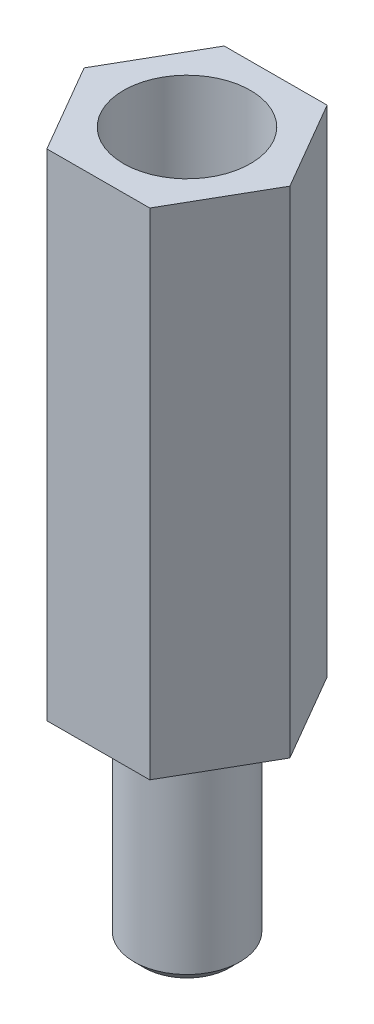
ISO-10303-21;
HEADER;
FILE_DESCRIPTION(('STEP AP214'),'2;1');
FILE_NAME('part.step','',(''),(''),'','','');
FILE_SCHEMA(('AUTOMOTIVE_DESIGN { 1 0 10303 214 1 1 1 1 }'));
ENDSEC;
DATA;
#1=APPLICATION_CONTEXT('core data for automotive mechanical design processes');
#2=APPLICATION_PROTOCOL_DEFINITION('international standard','automotive_design',2000,#1);
#3=PRODUCT_CONTEXT('',#1,'mechanical');
#4=PRODUCT('Part','Part','',(#3));
#5=PRODUCT_RELATED_PRODUCT_CATEGORY('part','',(#4));
#6=PRODUCT_DEFINITION_FORMATION('','',#4);
#7=PRODUCT_DEFINITION_CONTEXT('part definition',#1,'design');
#8=PRODUCT_DEFINITION('design','',#6,#7);
#9=PRODUCT_DEFINITION_SHAPE('','',#8);
#10=(LENGTH_UNIT() NAMED_UNIT(*) SI_UNIT(.MILLI.,.METRE.));
#11=(NAMED_UNIT(*) PLANE_ANGLE_UNIT() SI_UNIT($,.RADIAN.));
#12=(NAMED_UNIT(*) SI_UNIT($,.STERADIAN.) SOLID_ANGLE_UNIT());
#13=UNCERTAINTY_MEASURE_WITH_UNIT(LENGTH_MEASURE(1.E-05),#10,'distance_accuracy_value','');
#14=(GEOMETRIC_REPRESENTATION_CONTEXT(3) GLOBAL_UNCERTAINTY_ASSIGNED_CONTEXT((#13)) GLOBAL_UNIT_ASSIGNED_CONTEXT((#10,
#11,#12)) REPRESENTATION_CONTEXT('',''));
#15=CARTESIAN_POINT('',(0.,0.,0.));
#16=DIRECTION('',(0.,0.,1.));
#17=DIRECTION('',(1.,0.,0.));
#18=AXIS2_PLACEMENT_3D('',#15,#16,#17);
#19=CARTESIAN_POINT('',(1.20724982800236,11.7,-2.10298546185852));
#20=DIRECTION('',(0.00246764089411733,0.,0.999996955369574));
#21=DIRECTION('',(0.999996955369574,0.,-0.00246764089411733));
#22=AXIS2_PLACEMENT_3D('',#19,#20,#21);
#23=PLANE('',#22);
#24=DIRECTION('',(-0.999996955369574,0.,0.00246764089411733));
#25=VECTOR('',#24,1.);
#26=CARTESIAN_POINT('',(1.20724982800236,0.,-2.10298546185852));
#27=LINE('',#26,#25);
#28=CARTESIAN_POINT('',(1.20724982800236,0.,-2.10298546185852));
#29=VERTEX_POINT('',#28);
#30=CARTESIAN_POINT('',(-1.21761391975765,0.,-2.09700175069369));
#31=VERTEX_POINT('',#30);
#32=EDGE_CURVE('E124',#29,#31,#27,.T.);
#33=ORIENTED_EDGE('',*,*,#32,.T.);
#34=DIRECTION('',(0.,-1.,0.));
#35=VECTOR('',#34,1.);
#36=CARTESIAN_POINT('',(-1.21761391975765,11.7,-2.09700175069369));
#37=LINE('',#36,#35);
#38=CARTESIAN_POINT('',(-1.21761391975765,11.7,-2.09700175069369));
#39=VERTEX_POINT('',#38);
#40=EDGE_CURVE('E11',#39,#31,#37,.T.);
#41=ORIENTED_EDGE('',*,*,#40,.F.);
#42=DIRECTION('',(-0.999996955369574,0.,0.00246764089411733));
#43=VECTOR('',#42,1.);
#44=CARTESIAN_POINT('',(1.20724982800236,11.7,-2.10298546185852));
#45=LINE('',#44,#43);
#46=CARTESIAN_POINT('',(1.20724982800236,11.7,-2.10298546185852));
#47=VERTEX_POINT('',#46);
#48=EDGE_CURVE('E135',#47,#39,#45,.T.);
#49=ORIENTED_EDGE('',*,*,#48,.F.);
#50=DIRECTION('',(0.,-1.,0.));
#51=VECTOR('',#50,1.);
#52=CARTESIAN_POINT('',(1.20724982800236,11.7,-2.10298546185852));
#53=LINE('',#52,#51);
#54=EDGE_CURVE('E120',#47,#29,#53,.T.);
#55=ORIENTED_EDGE('',*,*,#54,.T.);
#56=EDGE_LOOP('',(#33,#41,#49,#55));
#57=FACE_BOUND('',#56,.T.);
#58=ADVANCED_FACE('F40',(#57),#23,.F.);
#59=CARTESIAN_POINT('',(-1.21761391975765,11.7,-2.09700175069369));
#60=DIRECTION('',(0.867256587504203,0.,0.497861437983064));
#61=DIRECTION('',(0.497861437983064,0.,-0.867256587504203));
#62=AXIS2_PLACEMENT_3D('',#59,#60,#61);
#63=PLANE('',#62);
#64=DIRECTION('',(-0.497861437983064,0.,0.867256587504203));
#65=VECTOR('',#64,1.);
#66=CARTESIAN_POINT('',(-1.21761391975765,0.,-2.09700175069369));
#67=LINE('',#66,#65);
#68=CARTESIAN_POINT('',(-2.42486374776001,0.,0.00598371116482524));
#69=VERTEX_POINT('',#68);
#70=EDGE_CURVE('E127',#31,#69,#67,.T.);
#71=ORIENTED_EDGE('',*,*,#70,.T.);
#72=DIRECTION('',(0.,-1.,0.));
#73=VECTOR('',#72,1.);
#74=CARTESIAN_POINT('',(-2.42486374776001,11.7,0.00598371116482524));
#75=LINE('',#74,#73);
#76=CARTESIAN_POINT('',(-2.42486374776001,11.7,0.00598371116482524));
#77=VERTEX_POINT('',#76);
#78=EDGE_CURVE('E48',#77,#69,#75,.T.);
#79=ORIENTED_EDGE('',*,*,#78,.F.);
#80=DIRECTION('',(-0.497861437983064,0.,0.867256587504203));
#81=VECTOR('',#80,1.);
#82=CARTESIAN_POINT('',(-1.21761391975765,11.7,-2.09700175069369));
#83=LINE('',#82,#81);
#84=EDGE_CURVE('E93',#39,#77,#83,.T.);
#85=ORIENTED_EDGE('',*,*,#84,.F.);
#86=ORIENTED_EDGE('',*,*,#40,.T.);
#87=EDGE_LOOP('',(#71,#79,#85,#86));
#88=FACE_BOUND('',#87,.T.);
#89=ADVANCED_FACE('F161',(#88),#63,.F.);
#90=CARTESIAN_POINT('',(-2.42486374776001,11.7,0.00598371116482524));
#91=DIRECTION('',(0.864788946610086,0.,-0.50213551738651));
#92=DIRECTION('',(-0.50213551738651,0.,-0.864788946610086));
#93=AXIS2_PLACEMENT_3D('',#90,#91,#92);
#94=PLANE('',#93);
#95=DIRECTION('',(0.50213551738651,0.,0.864788946610086));
#96=VECTOR('',#95,1.);
#97=CARTESIAN_POINT('',(-2.42486374776001,0.,0.00598371116482524));
#98=LINE('',#97,#96);
#99=CARTESIAN_POINT('',(-1.20724982800236,0.,2.10298546185852));
#100=VERTEX_POINT('',#99);
#101=EDGE_CURVE('E130',#69,#100,#98,.T.);
#102=ORIENTED_EDGE('',*,*,#101,.T.);
#103=DIRECTION('',(0.,-1.,0.));
#104=VECTOR('',#103,1.);
#105=CARTESIAN_POINT('',(-1.20724982800236,11.7,2.10298546185852));
#106=LINE('',#105,#104);
#107=CARTESIAN_POINT('',(-1.20724982800236,11.7,2.10298546185852));
#108=VERTEX_POINT('',#107);
#109=EDGE_CURVE('E115',#108,#100,#106,.T.);
#110=ORIENTED_EDGE('',*,*,#109,.F.);
#111=DIRECTION('',(0.50213551738651,0.,0.864788946610086));
#112=VECTOR('',#111,1.);
#113=CARTESIAN_POINT('',(-2.42486374776001,11.7,0.00598371116482524));
#114=LINE('',#113,#112);
#115=EDGE_CURVE('E106',#77,#108,#114,.T.);
#116=ORIENTED_EDGE('',*,*,#115,.F.);
#117=ORIENTED_EDGE('',*,*,#78,.T.);
#118=EDGE_LOOP('',(#102,#110,#116,#117));
#119=FACE_BOUND('',#118,.T.);
#120=ADVANCED_FACE('F141',(#119),#94,.F.);
#121=CARTESIAN_POINT('',(-1.20724982800236,11.7,2.10298546185852));
#122=DIRECTION('',(-0.00246764089411769,0.,-0.999996955369574));
#123=DIRECTION('',(-0.999996955369574,0.,0.00246764089411769));
#124=AXIS2_PLACEMENT_3D('',#121,#122,#123);
#125=PLANE('',#124);
#126=DIRECTION('',(0.999996955369574,0.,-0.00246764089411769));
#127=VECTOR('',#126,1.);
#128=CARTESIAN_POINT('',(-1.20724982800236,0.,2.10298546185852));
#129=LINE('',#128,#127);
#130=CARTESIAN_POINT('',(1.21761391975765,0.,2.09700175069369));
#131=VERTEX_POINT('',#130);
#132=EDGE_CURVE('E114',#100,#131,#129,.T.);
#133=ORIENTED_EDGE('',*,*,#132,.T.);
#134=DIRECTION('',(0.,-1.,0.));
#135=VECTOR('',#134,1.);
#136=CARTESIAN_POINT('',(1.21761391975765,11.7,2.09700175069369));
#137=LINE('',#136,#135);
#138=CARTESIAN_POINT('',(1.21761391975765,11.7,2.09700175069369));
#139=VERTEX_POINT('',#138);
#140=EDGE_CURVE('E111',#139,#131,#137,.T.);
#141=ORIENTED_EDGE('',*,*,#140,.F.);
#142=DIRECTION('',(0.999996955369574,0.,-0.00246764089411769));
#143=VECTOR('',#142,1.);
#144=CARTESIAN_POINT('',(-1.20724982800236,11.7,2.10298546185852));
#145=LINE('',#144,#143);
#146=EDGE_CURVE('E100',#108,#139,#145,.T.);
#147=ORIENTED_EDGE('',*,*,#146,.F.);
#148=ORIENTED_EDGE('',*,*,#109,.T.);
#149=EDGE_LOOP('',(#133,#141,#147,#148));
#150=FACE_BOUND('',#149,.T.);
#151=ADVANCED_FACE('F112',(#150),#125,.F.);
#152=CARTESIAN_POINT('',(1.21761391975765,11.7,2.09700175069369));
#153=DIRECTION('',(-0.867256587504203,0.,-0.497861437983064));
#154=DIRECTION('',(-0.497861437983064,0.,0.867256587504203));
#155=AXIS2_PLACEMENT_3D('',#152,#153,#154);
#156=PLANE('',#155);
#157=DIRECTION('',(0.497861437983064,0.,-0.867256587504203));
#158=VECTOR('',#157,1.);
#159=CARTESIAN_POINT('',(1.21761391975765,0.,2.09700175069369));
#160=LINE('',#159,#158);
#161=CARTESIAN_POINT('',(2.42486374776001,0.,-0.00598371116482452));
#162=VERTEX_POINT('',#161);
#163=EDGE_CURVE('E79',#131,#162,#160,.T.);
#164=ORIENTED_EDGE('',*,*,#163,.T.);
#165=DIRECTION('',(0.,-1.,0.));
#166=VECTOR('',#165,1.);
#167=CARTESIAN_POINT('',(2.42486374776001,11.7,-0.00598371116482452));
#168=LINE('',#167,#166);
#169=CARTESIAN_POINT('',(2.42486374776001,11.7,-0.00598371116482452));
#170=VERTEX_POINT('',#169);
#171=EDGE_CURVE('E116',#170,#162,#168,.T.);
#172=ORIENTED_EDGE('',*,*,#171,.F.);
#173=DIRECTION('',(0.497861437983064,0.,-0.867256587504203));
#174=VECTOR('',#173,1.);
#175=CARTESIAN_POINT('',(1.21761391975765,11.7,2.09700175069369));
#176=LINE('',#175,#174);
#177=EDGE_CURVE('E104',#139,#170,#176,.T.);
#178=ORIENTED_EDGE('',*,*,#177,.F.);
#179=ORIENTED_EDGE('',*,*,#140,.T.);
#180=EDGE_LOOP('',(#164,#172,#178,#179));
#181=FACE_BOUND('',#180,.T.);
#182=ADVANCED_FACE('F118',(#181),#156,.F.);
#183=CARTESIAN_POINT('',(2.42486374776001,11.7,-0.00598371116482452));
#184=DIRECTION('',(-0.864788946610086,0.,0.50213551738651));
#185=DIRECTION('',(0.50213551738651,0.,0.864788946610086));
#186=AXIS2_PLACEMENT_3D('',#183,#184,#185);
#187=PLANE('',#186);
#188=DIRECTION('',(-0.50213551738651,0.,-0.864788946610086));
#189=VECTOR('',#188,1.);
#190=CARTESIAN_POINT('',(2.42486374776001,0.,-0.00598371116482452));
#191=LINE('',#190,#189);
#192=EDGE_CURVE('E85',#162,#29,#191,.T.);
#193=ORIENTED_EDGE('',*,*,#192,.T.);
#194=ORIENTED_EDGE('',*,*,#54,.F.);
#195=DIRECTION('',(-0.50213551738651,0.,-0.864788946610086));
#196=VECTOR('',#195,1.);
#197=CARTESIAN_POINT('',(2.42486374776001,11.7,-0.00598371116482452));
#198=LINE('',#197,#196);
#199=EDGE_CURVE('E56',#170,#47,#198,.T.);
#200=ORIENTED_EDGE('',*,*,#199,.F.);
#201=ORIENTED_EDGE('',*,*,#171,.T.);
#202=EDGE_LOOP('',(#193,#194,#200,#201));
#203=FACE_BOUND('',#202,.T.);
#204=ADVANCED_FACE('F149',(#203),#187,.F.);
#205=CARTESIAN_POINT('',(0.,11.7,0.));
#206=DIRECTION('',(0.,1.,0.));
#207=DIRECTION('',(0.,0.,1.));
#208=AXIS2_PLACEMENT_3D('',#205,#206,#207);
#209=PLANE('',#208);
#210=CARTESIAN_POINT('',(0.,11.7,0.));
#211=DIRECTION('',(0.,1.,0.));
#212=DIRECTION('',(0.,0.,1.));
#213=AXIS2_PLACEMENT_3D('',#210,#211,#212);
#214=CIRCLE('',#213,1.5);
#215=CARTESIAN_POINT('',(0.,11.7,1.5));
#216=VERTEX_POINT('',#215);
#217=EDGE_CURVE('E269',#216,#216,#214,.T.);
#218=ORIENTED_EDGE('',*,*,#217,.F.);
#219=EDGE_LOOP('',(#218));
#220=FACE_BOUND('',#219,.T.);
#221=ORIENTED_EDGE('',*,*,#48,.T.);
#222=ORIENTED_EDGE('',*,*,#84,.T.);
#223=ORIENTED_EDGE('',*,*,#115,.T.);
#224=ORIENTED_EDGE('',*,*,#146,.T.);
#225=ORIENTED_EDGE('',*,*,#177,.T.);
#226=ORIENTED_EDGE('',*,*,#199,.T.);
#227=EDGE_LOOP('',(#221,#222,#223,#224,#225,#226));
#228=FACE_BOUND('',#227,.T.);
#229=ADVANCED_FACE('F102',(#220,#228),#209,.T.);
#230=CARTESIAN_POINT('',(0.,0.,0.));
#231=DIRECTION('',(0.,1.,0.));
#232=DIRECTION('',(0.,0.,1.));
#233=AXIS2_PLACEMENT_3D('',#230,#231,#232);
#234=PLANE('',#233);
#235=ORIENTED_EDGE('',*,*,#32,.F.);
#236=ORIENTED_EDGE('',*,*,#192,.F.);
#237=ORIENTED_EDGE('',*,*,#163,.F.);
#238=ORIENTED_EDGE('',*,*,#132,.F.);
#239=ORIENTED_EDGE('',*,*,#101,.F.);
#240=ORIENTED_EDGE('',*,*,#70,.F.);
#241=EDGE_LOOP('',(#235,#236,#237,#238,#239,#240));
#242=FACE_BOUND('',#241,.T.);
#243=CARTESIAN_POINT('',(0.,0.,0.));
#244=DIRECTION('',(0.,1.,0.));
#245=DIRECTION('',(0.,0.,1.));
#246=AXIS2_PLACEMENT_3D('',#243,#244,#245);
#247=CIRCLE('',#246,1.25);
#248=CARTESIAN_POINT('',(0.,0.,1.25));
#249=VERTEX_POINT('',#248);
#250=EDGE_CURVE('E270',#249,#249,#247,.T.);
#251=ORIENTED_EDGE('',*,*,#250,.T.);
#252=EDGE_LOOP('',(#251));
#253=FACE_BOUND('',#252,.T.);
#254=ADVANCED_FACE('F144',(#242,#253),#234,.F.);
#255=CARTESIAN_POINT('',(0.,1.7,0.));
#256=DIRECTION('',(0.,1.,0.));
#257=DIRECTION('',(0.,0.,1.));
#258=AXIS2_PLACEMENT_3D('',#255,#256,#257);
#259=CYLINDRICAL_SURFACE('',#258,1.5);
#260=CARTESIAN_POINT('',(0.,1.7,0.));
#261=DIRECTION('',(0.,1.,0.));
#262=DIRECTION('',(0.,0.,1.));
#263=AXIS2_PLACEMENT_3D('',#260,#261,#262);
#264=CIRCLE('',#263,1.5);
#265=CARTESIAN_POINT('',(0.,1.7,1.5));
#266=VERTEX_POINT('',#265);
#267=EDGE_CURVE('E128',#266,#266,#264,.T.);
#268=ORIENTED_EDGE('',*,*,#267,.F.);
#269=EDGE_LOOP('',(#268));
#270=FACE_BOUND('',#269,.T.);
#271=ORIENTED_EDGE('',*,*,#217,.T.);
#272=EDGE_LOOP('',(#271));
#273=FACE_BOUND('',#272,.T.);
#274=ADVANCED_FACE('F219',(#270,#273),#259,.F.);
#275=CARTESIAN_POINT('',(0.,1.7,0.));
#276=DIRECTION('',(0.,1.,0.));
#277=DIRECTION('',(0.,0.,1.));
#278=AXIS2_PLACEMENT_3D('',#275,#276,#277);
#279=PLANE('',#278);
#280=ORIENTED_EDGE('',*,*,#267,.T.);
#281=EDGE_LOOP('',(#280));
#282=FACE_BOUND('',#281,.T.);
#283=ADVANCED_FACE('F207',(#282),#279,.T.);
#284=CARTESIAN_POINT('',(0.,-5.,0.));
#285=DIRECTION('',(0.,1.,0.));
#286=DIRECTION('',(0.,0.,1.));
#287=AXIS2_PLACEMENT_3D('',#284,#285,#286);
#288=CYLINDRICAL_SURFACE('',#287,1.25);
#289=ORIENTED_EDGE('',*,*,#250,.F.);
#290=EDGE_LOOP('',(#289));
#291=FACE_BOUND('',#290,.T.);
#292=CARTESIAN_POINT('',(0.,-4.7565,0.));
#293=DIRECTION('',(0.,1.,0.));
#294=DIRECTION('',(0.,0.,1.));
#295=AXIS2_PLACEMENT_3D('',#292,#293,#294);
#296=CIRCLE('',#295,1.25);
#297=CARTESIAN_POINT('',(0.,-4.7565,1.25));
#298=VERTEX_POINT('',#297);
#299=EDGE_CURVE('E281',#298,#298,#296,.T.);
#300=ORIENTED_EDGE('',*,*,#299,.T.);
#301=EDGE_LOOP('',(#300));
#302=FACE_BOUND('',#301,.T.);
#303=ADVANCED_FACE('F201',(#291,#302),#288,.T.);
#304=CARTESIAN_POINT('',(0.,-5.,0.));
#305=DIRECTION('',(0.,1.,0.));
#306=DIRECTION('',(0.,0.,1.));
#307=AXIS2_PLACEMENT_3D('',#304,#305,#306);
#308=CONICAL_SURFACE('',#307,1.0065,0.785398163397449);
#309=ORIENTED_EDGE('',*,*,#299,.F.);
#310=EDGE_LOOP('',(#309));
#311=FACE_BOUND('',#310,.T.);
#312=CARTESIAN_POINT('',(0.,-5.,0.));
#313=DIRECTION('',(0.,1.,0.));
#314=DIRECTION('',(0.,0.,1.));
#315=AXIS2_PLACEMENT_3D('',#312,#313,#314);
#316=CIRCLE('',#315,1.0065);
#317=CARTESIAN_POINT('',(0.,-5.,1.0065));
#318=VERTEX_POINT('',#317);
#319=EDGE_CURVE('E274',#318,#318,#316,.T.);
#320=ORIENTED_EDGE('',*,*,#319,.T.);
#321=EDGE_LOOP('',(#320));
#322=FACE_BOUND('',#321,.T.);
#323=ADVANCED_FACE('F206',(#311,#322),#308,.T.);
#324=CARTESIAN_POINT('',(0.,-5.,0.));
#325=DIRECTION('',(0.,-1.,0.));
#326=DIRECTION('',(0.,0.,-1.));
#327=AXIS2_PLACEMENT_3D('',#324,#325,#326);
#328=PLANE('',#327);
#329=ORIENTED_EDGE('',*,*,#319,.F.);
#330=EDGE_LOOP('',(#329));
#331=FACE_BOUND('',#330,.T.);
#332=ADVANCED_FACE('F225',(#331),#328,.T.);
#333=CLOSED_SHELL('',(#58,#89,#120,#151,#182,#204,#229,#254,#274,#283,#303,#323,#332));
#334=MANIFOLD_SOLID_BREP('B2',#333);
#335=ADVANCED_BREP_SHAPE_REPRESENTATION('',(#18,#334),#14);
#336=SHAPE_DEFINITION_REPRESENTATION(#9,#335);
ENDSEC;
END-ISO-10303-21;
